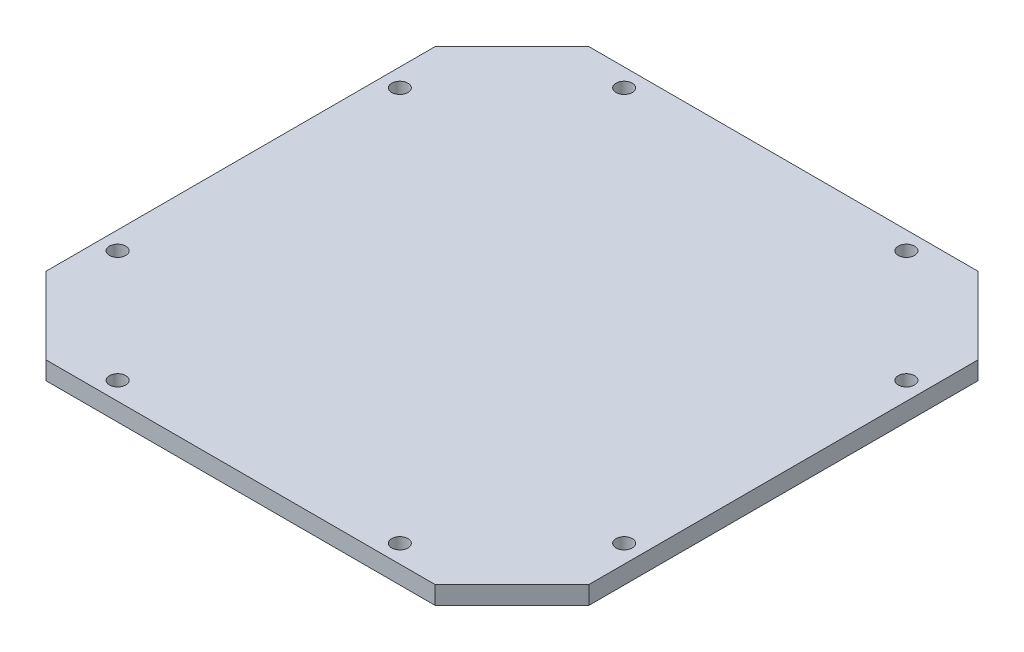
ISO-10303-21;
HEADER;
FILE_DESCRIPTION(('STEP AP214'),'2;1');
FILE_NAME('part.step','',(''),(''),'','','');
FILE_SCHEMA(('AUTOMOTIVE_DESIGN { 1 0 10303 214 1 1 1 1 }'));
ENDSEC;
DATA;
#1=APPLICATION_CONTEXT('core data for automotive mechanical design processes');
#2=APPLICATION_PROTOCOL_DEFINITION('international standard','automotive_design',2000,#1);
#3=PRODUCT_CONTEXT('',#1,'mechanical');
#4=PRODUCT('Part','Part','',(#3));
#5=PRODUCT_RELATED_PRODUCT_CATEGORY('part','',(#4));
#6=PRODUCT_DEFINITION_FORMATION('','',#4);
#7=PRODUCT_DEFINITION_CONTEXT('part definition',#1,'design');
#8=PRODUCT_DEFINITION('design','',#6,#7);
#9=PRODUCT_DEFINITION_SHAPE('','',#8);
#10=(LENGTH_UNIT() NAMED_UNIT(*) SI_UNIT(.MILLI.,.METRE.));
#11=(NAMED_UNIT(*) PLANE_ANGLE_UNIT() SI_UNIT($,.RADIAN.));
#12=(NAMED_UNIT(*) SI_UNIT($,.STERADIAN.) SOLID_ANGLE_UNIT());
#13=UNCERTAINTY_MEASURE_WITH_UNIT(LENGTH_MEASURE(1.E-05),#10,'distance_accuracy_value','');
#14=(GEOMETRIC_REPRESENTATION_CONTEXT(3) GLOBAL_UNCERTAINTY_ASSIGNED_CONTEXT((#13)) GLOBAL_UNIT_ASSIGNED_CONTEXT((#10,
#11,#12)) REPRESENTATION_CONTEXT('',''));
#15=CARTESIAN_POINT('',(0.,0.,0.));
#16=DIRECTION('',(0.,0.,1.));
#17=DIRECTION('',(1.,0.,0.));
#18=AXIS2_PLACEMENT_3D('',#15,#16,#17);
#19=CARTESIAN_POINT('',(0.,5.,0.));
#20=DIRECTION('',(0.,-1.,0.));
#21=DIRECTION('',(0.,0.,-1.));
#22=AXIS2_PLACEMENT_3D('',#19,#20,#21);
#23=PLANE('',#22);
#24=DIRECTION('',(-0.707106781186546,0.,-0.707106781186549));
#25=VECTOR('',#24,1.);
#26=CARTESIAN_POINT('',(107.573593128807,5.,-150.));
#27=LINE('',#26,#25);
#28=CARTESIAN_POINT('',(150.,5.,-107.573593128807));
#29=VERTEX_POINT('',#28);
#30=CARTESIAN_POINT('',(107.573593128807,5.,-150.));
#31=VERTEX_POINT('',#30);
#32=EDGE_CURVE('E151',#29,#31,#27,.T.);
#33=ORIENTED_EDGE('',*,*,#32,.T.);
#34=DIRECTION('',(-1.,0.,0.));
#35=VECTOR('',#34,1.);
#36=CARTESIAN_POINT('',(107.573593128807,5.,-150.));
#37=LINE('',#36,#35);
#38=CARTESIAN_POINT('',(-107.573593128807,5.,-150.));
#39=VERTEX_POINT('',#38);
#40=EDGE_CURVE('E99',#31,#39,#37,.T.);
#41=ORIENTED_EDGE('',*,*,#40,.T.);
#42=DIRECTION('',(-0.707106781186546,0.,0.707106781186549));
#43=VECTOR('',#42,1.);
#44=CARTESIAN_POINT('',(-107.573593128807,5.,-150.));
#45=LINE('',#44,#43);
#46=CARTESIAN_POINT('',(-150.,5.,-107.573593128807));
#47=VERTEX_POINT('',#46);
#48=EDGE_CURVE('E166',#39,#47,#45,.T.);
#49=ORIENTED_EDGE('',*,*,#48,.T.);
#50=DIRECTION('',(0.,0.,1.));
#51=VECTOR('',#50,1.);
#52=CARTESIAN_POINT('',(-150.,5.,-107.573593128807));
#53=LINE('',#52,#51);
#54=CARTESIAN_POINT('',(-150.,5.,107.573593128807));
#55=VERTEX_POINT('',#54);
#56=EDGE_CURVE('E179',#47,#55,#53,.T.);
#57=ORIENTED_EDGE('',*,*,#56,.T.);
#58=DIRECTION('',(0.707106781186545,0.,0.70710678118655));
#59=VECTOR('',#58,1.);
#60=CARTESIAN_POINT('',(-150.,5.,107.573593128807));
#61=LINE('',#60,#59);
#62=CARTESIAN_POINT('',(-107.573593128807,5.,150.));
#63=VERTEX_POINT('',#62);
#64=EDGE_CURVE('E118',#55,#63,#61,.T.);
#65=ORIENTED_EDGE('',*,*,#64,.T.);
#66=DIRECTION('',(1.,0.,0.));
#67=VECTOR('',#66,1.);
#68=CARTESIAN_POINT('',(-107.573593128807,5.,150.));
#69=LINE('',#68,#67);
#70=CARTESIAN_POINT('',(107.573593128807,5.,150.));
#71=VERTEX_POINT('',#70);
#72=EDGE_CURVE('E112',#63,#71,#69,.T.);
#73=ORIENTED_EDGE('',*,*,#72,.T.);
#74=DIRECTION('',(0.707106781186545,0.,-0.70710678118655));
#75=VECTOR('',#74,1.);
#76=CARTESIAN_POINT('',(150.,5.,107.573593128807));
#77=LINE('',#76,#75);
#78=CARTESIAN_POINT('',(150.,5.,107.573593128807));
#79=VERTEX_POINT('',#78);
#80=EDGE_CURVE('E116',#71,#79,#77,.T.);
#81=ORIENTED_EDGE('',*,*,#80,.T.);
#82=DIRECTION('',(0.,0.,-1.));
#83=VECTOR('',#82,1.);
#84=CARTESIAN_POINT('',(150.,5.,-107.573593128807));
#85=LINE('',#84,#83);
#86=EDGE_CURVE('E56',#79,#29,#85,.T.);
#87=ORIENTED_EDGE('',*,*,#86,.T.);
#88=EDGE_LOOP('',(#33,#41,#49,#57,#65,#73,#81,#87));
#89=FACE_BOUND('',#88,.T.);
#90=CARTESIAN_POINT('',(-78.,5.,-140.));
#91=DIRECTION('',(0.,1.,0.));
#92=DIRECTION('',(0.,0.,1.));
#93=AXIS2_PLACEMENT_3D('',#90,#91,#92);
#94=CIRCLE('',#93,4.50000000000001);
#95=CARTESIAN_POINT('',(-78.,5.,-135.5));
#96=VERTEX_POINT('',#95);
#97=EDGE_CURVE('E140',#96,#96,#94,.T.);
#98=ORIENTED_EDGE('',*,*,#97,.F.);
#99=EDGE_LOOP('',(#98));
#100=FACE_BOUND('',#99,.T.);
#101=CARTESIAN_POINT('',(78.,5.,-140.));
#102=DIRECTION('',(0.,1.,0.));
#103=DIRECTION('',(0.,0.,-1.));
#104=AXIS2_PLACEMENT_3D('',#101,#102,#103);
#105=CIRCLE('',#104,4.50000000000001);
#106=CARTESIAN_POINT('',(78.,5.,-144.5));
#107=VERTEX_POINT('',#106);
#108=EDGE_CURVE('E188',#107,#107,#105,.T.);
#109=ORIENTED_EDGE('',*,*,#108,.F.);
#110=EDGE_LOOP('',(#109));
#111=FACE_BOUND('',#110,.T.);
#112=CARTESIAN_POINT('',(-140.,5.,-78.));
#113=DIRECTION('',(0.,1.,0.));
#114=DIRECTION('',(0.,0.,1.));
#115=AXIS2_PLACEMENT_3D('',#112,#113,#114);
#116=CIRCLE('',#115,4.49999999999999);
#117=CARTESIAN_POINT('',(-140.,5.,-73.5));
#118=VERTEX_POINT('',#117);
#119=EDGE_CURVE('E194',#118,#118,#116,.T.);
#120=ORIENTED_EDGE('',*,*,#119,.F.);
#121=EDGE_LOOP('',(#120));
#122=FACE_BOUND('',#121,.T.);
#123=CARTESIAN_POINT('',(140.,5.,-78.));
#124=DIRECTION('',(0.,1.,0.));
#125=DIRECTION('',(0.,0.,-1.));
#126=AXIS2_PLACEMENT_3D('',#123,#124,#125);
#127=CIRCLE('',#126,4.49999999999999);
#128=CARTESIAN_POINT('',(140.,5.,-82.5));
#129=VERTEX_POINT('',#128);
#130=EDGE_CURVE('E200',#129,#129,#127,.T.);
#131=ORIENTED_EDGE('',*,*,#130,.F.);
#132=EDGE_LOOP('',(#131));
#133=FACE_BOUND('',#132,.T.);
#134=CARTESIAN_POINT('',(-140.,5.,77.9999999999999));
#135=DIRECTION('',(0.,1.,0.));
#136=DIRECTION('',(0.,0.,1.));
#137=AXIS2_PLACEMENT_3D('',#134,#135,#136);
#138=CIRCLE('',#137,4.49999999999999);
#139=CARTESIAN_POINT('',(-140.,5.,82.4999999999999));
#140=VERTEX_POINT('',#139);
#141=EDGE_CURVE('E206',#140,#140,#138,.T.);
#142=ORIENTED_EDGE('',*,*,#141,.F.);
#143=EDGE_LOOP('',(#142));
#144=FACE_BOUND('',#143,.T.);
#145=CARTESIAN_POINT('',(140.,5.,77.9999999999999));
#146=DIRECTION('',(0.,1.,0.));
#147=DIRECTION('',(0.,0.,-1.));
#148=AXIS2_PLACEMENT_3D('',#145,#146,#147);
#149=CIRCLE('',#148,4.49999999999999);
#150=CARTESIAN_POINT('',(140.,5.,73.5));
#151=VERTEX_POINT('',#150);
#152=EDGE_CURVE('E212',#151,#151,#149,.T.);
#153=ORIENTED_EDGE('',*,*,#152,.F.);
#154=EDGE_LOOP('',(#153));
#155=FACE_BOUND('',#154,.T.);
#156=CARTESIAN_POINT('',(-78.,5.,140.));
#157=DIRECTION('',(0.,1.,0.));
#158=DIRECTION('',(0.,0.,1.));
#159=AXIS2_PLACEMENT_3D('',#156,#157,#158);
#160=CIRCLE('',#159,4.50000000000001);
#161=CARTESIAN_POINT('',(-78.,5.,144.5));
#162=VERTEX_POINT('',#161);
#163=EDGE_CURVE('E218',#162,#162,#160,.T.);
#164=ORIENTED_EDGE('',*,*,#163,.F.);
#165=EDGE_LOOP('',(#164));
#166=FACE_BOUND('',#165,.T.);
#167=CARTESIAN_POINT('',(78.,5.,140.));
#168=DIRECTION('',(0.,1.,0.));
#169=DIRECTION('',(0.,0.,-1.));
#170=AXIS2_PLACEMENT_3D('',#167,#168,#169);
#171=CIRCLE('',#170,4.50000000000001);
#172=CARTESIAN_POINT('',(78.,5.,135.5));
#173=VERTEX_POINT('',#172);
#174=EDGE_CURVE('E224',#173,#173,#171,.T.);
#175=ORIENTED_EDGE('',*,*,#174,.F.);
#176=EDGE_LOOP('',(#175));
#177=FACE_BOUND('',#176,.T.);
#178=ADVANCED_FACE('F39',(#89,#100,#111,#122,#133,#144,#155,#166,#177),#23,.F.);
#179=CARTESIAN_POINT('',(0.,-5.,0.));
#180=DIRECTION('',(0.,-1.,0.));
#181=DIRECTION('',(0.,0.,-1.));
#182=AXIS2_PLACEMENT_3D('',#179,#180,#181);
#183=PLANE('',#182);
#184=CARTESIAN_POINT('',(-78.,-5.,140.));
#185=DIRECTION('',(0.,1.,0.));
#186=DIRECTION('',(0.,0.,1.));
#187=AXIS2_PLACEMENT_3D('',#184,#185,#186);
#188=CIRCLE('',#187,4.50000000000001);
#189=CARTESIAN_POINT('',(-78.,-5.,144.5));
#190=VERTEX_POINT('',#189);
#191=EDGE_CURVE('E221',#190,#190,#188,.T.);
#192=ORIENTED_EDGE('',*,*,#191,.T.);
#193=EDGE_LOOP('',(#192));
#194=FACE_BOUND('',#193,.T.);
#195=CARTESIAN_POINT('',(-140.,-5.,77.9999999999999));
#196=DIRECTION('',(0.,1.,0.));
#197=DIRECTION('',(0.,0.,1.));
#198=AXIS2_PLACEMENT_3D('',#195,#196,#197);
#199=CIRCLE('',#198,4.49999999999999);
#200=CARTESIAN_POINT('',(-140.,-5.,82.4999999999999));
#201=VERTEX_POINT('',#200);
#202=EDGE_CURVE('E209',#201,#201,#199,.T.);
#203=ORIENTED_EDGE('',*,*,#202,.T.);
#204=EDGE_LOOP('',(#203));
#205=FACE_BOUND('',#204,.T.);
#206=CARTESIAN_POINT('',(-140.,-5.,-78.));
#207=DIRECTION('',(0.,1.,0.));
#208=DIRECTION('',(0.,0.,1.));
#209=AXIS2_PLACEMENT_3D('',#206,#207,#208);
#210=CIRCLE('',#209,4.49999999999999);
#211=CARTESIAN_POINT('',(-140.,-5.,-73.5));
#212=VERTEX_POINT('',#211);
#213=EDGE_CURVE('E197',#212,#212,#210,.T.);
#214=ORIENTED_EDGE('',*,*,#213,.T.);
#215=EDGE_LOOP('',(#214));
#216=FACE_BOUND('',#215,.T.);
#217=CARTESIAN_POINT('',(-78.,-5.,-140.));
#218=DIRECTION('',(0.,1.,0.));
#219=DIRECTION('',(0.,0.,1.));
#220=AXIS2_PLACEMENT_3D('',#217,#218,#219);
#221=CIRCLE('',#220,4.50000000000001);
#222=CARTESIAN_POINT('',(-78.,-5.,-135.5));
#223=VERTEX_POINT('',#222);
#224=EDGE_CURVE('E185',#223,#223,#221,.T.);
#225=ORIENTED_EDGE('',*,*,#224,.T.);
#226=EDGE_LOOP('',(#225));
#227=FACE_BOUND('',#226,.T.);
#228=DIRECTION('',(-0.707106781186546,0.,-0.707106781186549));
#229=VECTOR('',#228,1.);
#230=CARTESIAN_POINT('',(107.573593128807,-5.,-150.));
#231=LINE('',#230,#229);
#232=CARTESIAN_POINT('',(150.,-5.,-107.573593128807));
#233=VERTEX_POINT('',#232);
#234=CARTESIAN_POINT('',(107.573593128807,-5.,-150.));
#235=VERTEX_POINT('',#234);
#236=EDGE_CURVE('E136',#233,#235,#231,.T.);
#237=ORIENTED_EDGE('',*,*,#236,.F.);
#238=DIRECTION('',(0.,0.,-1.));
#239=VECTOR('',#238,1.);
#240=CARTESIAN_POINT('',(150.,-5.,-107.573593128807));
#241=LINE('',#240,#239);
#242=CARTESIAN_POINT('',(150.,-5.,107.573593128807));
#243=VERTEX_POINT('',#242);
#244=EDGE_CURVE('E91',#243,#233,#241,.T.);
#245=ORIENTED_EDGE('',*,*,#244,.F.);
#246=DIRECTION('',(0.707106781186545,0.,-0.70710678118655));
#247=VECTOR('',#246,1.);
#248=CARTESIAN_POINT('',(150.,-5.,107.573593128807));
#249=LINE('',#248,#247);
#250=CARTESIAN_POINT('',(107.573593128807,-5.,150.));
#251=VERTEX_POINT('',#250);
#252=EDGE_CURVE('E85',#251,#243,#249,.T.);
#253=ORIENTED_EDGE('',*,*,#252,.F.);
#254=DIRECTION('',(1.,0.,0.));
#255=VECTOR('',#254,1.);
#256=CARTESIAN_POINT('',(-107.573593128807,-5.,150.));
#257=LINE('',#256,#255);
#258=CARTESIAN_POINT('',(-107.573593128807,-5.,150.));
#259=VERTEX_POINT('',#258);
#260=EDGE_CURVE('E126',#259,#251,#257,.T.);
#261=ORIENTED_EDGE('',*,*,#260,.F.);
#262=DIRECTION('',(0.707106781186545,0.,0.70710678118655));
#263=VECTOR('',#262,1.);
#264=CARTESIAN_POINT('',(-150.,-5.,107.573593128807));
#265=LINE('',#264,#263);
#266=CARTESIAN_POINT('',(-150.,-5.,107.573593128807));
#267=VERTEX_POINT('',#266);
#268=EDGE_CURVE('E146',#267,#259,#265,.T.);
#269=ORIENTED_EDGE('',*,*,#268,.F.);
#270=DIRECTION('',(0.,0.,1.));
#271=VECTOR('',#270,1.);
#272=CARTESIAN_POINT('',(-150.,-5.,-107.573593128807));
#273=LINE('',#272,#271);
#274=CARTESIAN_POINT('',(-150.,-5.,-107.573593128807));
#275=VERTEX_POINT('',#274);
#276=EDGE_CURVE('E144',#275,#267,#273,.T.);
#277=ORIENTED_EDGE('',*,*,#276,.F.);
#278=DIRECTION('',(-0.707106781186546,0.,0.707106781186549));
#279=VECTOR('',#278,1.);
#280=CARTESIAN_POINT('',(-107.573593128807,-5.,-150.));
#281=LINE('',#280,#279);
#282=CARTESIAN_POINT('',(-107.573593128807,-5.,-150.));
#283=VERTEX_POINT('',#282);
#284=EDGE_CURVE('E142',#283,#275,#281,.T.);
#285=ORIENTED_EDGE('',*,*,#284,.F.);
#286=DIRECTION('',(-1.,0.,0.));
#287=VECTOR('',#286,1.);
#288=CARTESIAN_POINT('',(107.573593128807,-5.,-150.));
#289=LINE('',#288,#287);
#290=EDGE_CURVE('E139',#235,#283,#289,.T.);
#291=ORIENTED_EDGE('',*,*,#290,.F.);
#292=EDGE_LOOP('',(#237,#245,#253,#261,#269,#277,#285,#291));
#293=FACE_BOUND('',#292,.T.);
#294=CARTESIAN_POINT('',(78.,-5.,-140.));
#295=DIRECTION('',(0.,1.,0.));
#296=DIRECTION('',(0.,0.,-1.));
#297=AXIS2_PLACEMENT_3D('',#294,#295,#296);
#298=CIRCLE('',#297,4.50000000000001);
#299=CARTESIAN_POINT('',(78.,-5.,-144.5));
#300=VERTEX_POINT('',#299);
#301=EDGE_CURVE('E191',#300,#300,#298,.T.);
#302=ORIENTED_EDGE('',*,*,#301,.T.);
#303=EDGE_LOOP('',(#302));
#304=FACE_BOUND('',#303,.T.);
#305=CARTESIAN_POINT('',(140.,-5.,-78.));
#306=DIRECTION('',(0.,1.,0.));
#307=DIRECTION('',(0.,0.,-1.));
#308=AXIS2_PLACEMENT_3D('',#305,#306,#307);
#309=CIRCLE('',#308,4.49999999999999);
#310=CARTESIAN_POINT('',(140.,-5.,-82.5));
#311=VERTEX_POINT('',#310);
#312=EDGE_CURVE('E203',#311,#311,#309,.T.);
#313=ORIENTED_EDGE('',*,*,#312,.T.);
#314=EDGE_LOOP('',(#313));
#315=FACE_BOUND('',#314,.T.);
#316=CARTESIAN_POINT('',(140.,-5.,77.9999999999999));
#317=DIRECTION('',(0.,1.,0.));
#318=DIRECTION('',(0.,0.,-1.));
#319=AXIS2_PLACEMENT_3D('',#316,#317,#318);
#320=CIRCLE('',#319,4.49999999999999);
#321=CARTESIAN_POINT('',(140.,-5.,73.5));
#322=VERTEX_POINT('',#321);
#323=EDGE_CURVE('E215',#322,#322,#320,.T.);
#324=ORIENTED_EDGE('',*,*,#323,.T.);
#325=EDGE_LOOP('',(#324));
#326=FACE_BOUND('',#325,.T.);
#327=CARTESIAN_POINT('',(78.,-5.,140.));
#328=DIRECTION('',(0.,1.,0.));
#329=DIRECTION('',(0.,0.,-1.));
#330=AXIS2_PLACEMENT_3D('',#327,#328,#329);
#331=CIRCLE('',#330,4.50000000000001);
#332=CARTESIAN_POINT('',(78.,-5.,135.5));
#333=VERTEX_POINT('',#332);
#334=EDGE_CURVE('E227',#333,#333,#331,.T.);
#335=ORIENTED_EDGE('',*,*,#334,.T.);
#336=EDGE_LOOP('',(#335));
#337=FACE_BOUND('',#336,.T.);
#338=ADVANCED_FACE('F170',(#194,#205,#216,#227,#293,#304,#315,#326,#337),#183,.T.);
#339=CARTESIAN_POINT('',(107.573593128807,5.,-150.));
#340=DIRECTION('',(-0.707106781186549,0.,0.707106781186546));
#341=DIRECTION('',(0.707106781186546,0.,0.707106781186549));
#342=AXIS2_PLACEMENT_3D('',#339,#340,#341);
#343=PLANE('',#342);
#344=ORIENTED_EDGE('',*,*,#236,.T.);
#345=DIRECTION('',(0.,-1.,0.));
#346=VECTOR('',#345,1.);
#347=CARTESIAN_POINT('',(107.573593128807,5.,-150.));
#348=LINE('',#347,#346);
#349=EDGE_CURVE('E11',#31,#235,#348,.T.);
#350=ORIENTED_EDGE('',*,*,#349,.F.);
#351=ORIENTED_EDGE('',*,*,#32,.F.);
#352=DIRECTION('',(0.,-1.,0.));
#353=VECTOR('',#352,1.);
#354=CARTESIAN_POINT('',(150.,5.,-107.573593128807));
#355=LINE('',#354,#353);
#356=EDGE_CURVE('E132',#29,#233,#355,.T.);
#357=ORIENTED_EDGE('',*,*,#356,.T.);
#358=EDGE_LOOP('',(#344,#350,#351,#357));
#359=FACE_BOUND('',#358,.T.);
#360=ADVANCED_FACE('F41',(#359),#343,.F.);
#361=CARTESIAN_POINT('',(107.573593128807,5.,-150.));
#362=DIRECTION('',(0.,0.,1.));
#363=DIRECTION('',(1.,0.,0.));
#364=AXIS2_PLACEMENT_3D('',#361,#362,#363);
#365=PLANE('',#364);
#366=ORIENTED_EDGE('',*,*,#290,.T.);
#367=DIRECTION('',(0.,-1.,0.));
#368=VECTOR('',#367,1.);
#369=CARTESIAN_POINT('',(-107.573593128807,5.,-150.));
#370=LINE('',#369,#368);
#371=EDGE_CURVE('E48',#39,#283,#370,.T.);
#372=ORIENTED_EDGE('',*,*,#371,.F.);
#373=ORIENTED_EDGE('',*,*,#40,.F.);
#374=ORIENTED_EDGE('',*,*,#349,.T.);
#375=EDGE_LOOP('',(#366,#372,#373,#374));
#376=FACE_BOUND('',#375,.T.);
#377=ADVANCED_FACE('F259',(#376),#365,.F.);
#378=CARTESIAN_POINT('',(-107.573593128807,5.,-150.));
#379=DIRECTION('',(0.707106781186549,0.,0.707106781186546));
#380=DIRECTION('',(0.707106781186546,0.,-0.707106781186549));
#381=AXIS2_PLACEMENT_3D('',#378,#379,#380);
#382=PLANE('',#381);
#383=ORIENTED_EDGE('',*,*,#284,.T.);
#384=DIRECTION('',(0.,-1.,0.));
#385=VECTOR('',#384,1.);
#386=CARTESIAN_POINT('',(-150.,5.,-107.573593128807));
#387=LINE('',#386,#385);
#388=EDGE_CURVE('E158',#47,#275,#387,.T.);
#389=ORIENTED_EDGE('',*,*,#388,.F.);
#390=ORIENTED_EDGE('',*,*,#48,.F.);
#391=ORIENTED_EDGE('',*,*,#371,.T.);
#392=EDGE_LOOP('',(#383,#389,#390,#391));
#393=FACE_BOUND('',#392,.T.);
#394=ADVANCED_FACE('F164',(#393),#382,.F.);
#395=CARTESIAN_POINT('',(-150.,5.,-107.573593128807));
#396=DIRECTION('',(1.,0.,0.));
#397=DIRECTION('',(0.,0.,-1.));
#398=AXIS2_PLACEMENT_3D('',#395,#396,#397);
#399=PLANE('',#398);
#400=ORIENTED_EDGE('',*,*,#276,.T.);
#401=DIRECTION('',(0.,-1.,0.));
#402=VECTOR('',#401,1.);
#403=CARTESIAN_POINT('',(-150.,5.,107.573593128807));
#404=LINE('',#403,#402);
#405=EDGE_CURVE('E155',#55,#267,#404,.T.);
#406=ORIENTED_EDGE('',*,*,#405,.F.);
#407=ORIENTED_EDGE('',*,*,#56,.F.);
#408=ORIENTED_EDGE('',*,*,#388,.T.);
#409=EDGE_LOOP('',(#400,#406,#407,#408));
#410=FACE_BOUND('',#409,.T.);
#411=ADVANCED_FACE('F175',(#410),#399,.F.);
#412=CARTESIAN_POINT('',(-150.,5.,107.573593128807));
#413=DIRECTION('',(0.70710678118655,0.,-0.707106781186545));
#414=DIRECTION('',(-0.707106781186545,0.,-0.70710678118655));
#415=AXIS2_PLACEMENT_3D('',#412,#413,#414);
#416=PLANE('',#415);
#417=ORIENTED_EDGE('',*,*,#268,.T.);
#418=DIRECTION('',(0.,-1.,0.));
#419=VECTOR('',#418,1.);
#420=CARTESIAN_POINT('',(-107.573593128807,5.,150.));
#421=LINE('',#420,#419);
#422=EDGE_CURVE('E127',#63,#259,#421,.T.);
#423=ORIENTED_EDGE('',*,*,#422,.F.);
#424=ORIENTED_EDGE('',*,*,#64,.F.);
#425=ORIENTED_EDGE('',*,*,#405,.T.);
#426=EDGE_LOOP('',(#417,#423,#424,#425));
#427=FACE_BOUND('',#426,.T.);
#428=ADVANCED_FACE('F178',(#427),#416,.F.);
#429=CARTESIAN_POINT('',(-107.573593128807,5.,150.));
#430=DIRECTION('',(0.,0.,-1.));
#431=DIRECTION('',(-1.,0.,0.));
#432=AXIS2_PLACEMENT_3D('',#429,#430,#431);
#433=PLANE('',#432);
#434=ORIENTED_EDGE('',*,*,#260,.T.);
#435=DIRECTION('',(0.,-1.,0.));
#436=VECTOR('',#435,1.);
#437=CARTESIAN_POINT('',(107.573593128807,5.,150.));
#438=LINE('',#437,#436);
#439=EDGE_CURVE('E123',#71,#251,#438,.T.);
#440=ORIENTED_EDGE('',*,*,#439,.F.);
#441=ORIENTED_EDGE('',*,*,#72,.F.);
#442=ORIENTED_EDGE('',*,*,#422,.T.);
#443=EDGE_LOOP('',(#434,#440,#441,#442));
#444=FACE_BOUND('',#443,.T.);
#445=ADVANCED_FACE('F124',(#444),#433,.F.);
#446=CARTESIAN_POINT('',(150.,5.,107.573593128807));
#447=DIRECTION('',(-0.70710678118655,0.,-0.707106781186545));
#448=DIRECTION('',(-0.707106781186545,0.,0.70710678118655));
#449=AXIS2_PLACEMENT_3D('',#446,#447,#448);
#450=PLANE('',#449);
#451=ORIENTED_EDGE('',*,*,#252,.T.);
#452=DIRECTION('',(0.,-1.,0.));
#453=VECTOR('',#452,1.);
#454=CARTESIAN_POINT('',(150.,5.,107.573593128807));
#455=LINE('',#454,#453);
#456=EDGE_CURVE('E128',#79,#243,#455,.T.);
#457=ORIENTED_EDGE('',*,*,#456,.F.);
#458=ORIENTED_EDGE('',*,*,#80,.F.);
#459=ORIENTED_EDGE('',*,*,#439,.T.);
#460=EDGE_LOOP('',(#451,#457,#458,#459));
#461=FACE_BOUND('',#460,.T.);
#462=ADVANCED_FACE('F130',(#461),#450,.F.);
#463=CARTESIAN_POINT('',(150.,5.,-107.573593128807));
#464=DIRECTION('',(-1.,0.,0.));
#465=DIRECTION('',(0.,0.,1.));
#466=AXIS2_PLACEMENT_3D('',#463,#464,#465);
#467=PLANE('',#466);
#468=ORIENTED_EDGE('',*,*,#244,.T.);
#469=ORIENTED_EDGE('',*,*,#356,.F.);
#470=ORIENTED_EDGE('',*,*,#86,.F.);
#471=ORIENTED_EDGE('',*,*,#456,.T.);
#472=EDGE_LOOP('',(#468,#469,#470,#471));
#473=FACE_BOUND('',#472,.T.);
#474=ADVANCED_FACE('F247',(#473),#467,.F.);
#475=CARTESIAN_POINT('',(-78.,5.,-140.));
#476=DIRECTION('',(0.,-1.,0.));
#477=DIRECTION('',(0.,0.,-1.));
#478=AXIS2_PLACEMENT_3D('',#475,#476,#477);
#479=CYLINDRICAL_SURFACE('',#478,4.50000000000001);
#480=ORIENTED_EDGE('',*,*,#97,.T.);
#481=EDGE_LOOP('',(#480));
#482=FACE_BOUND('',#481,.T.);
#483=ORIENTED_EDGE('',*,*,#224,.F.);
#484=EDGE_LOOP('',(#483));
#485=FACE_BOUND('',#484,.T.);
#486=ADVANCED_FACE('F244',(#482,#485),#479,.F.);
#487=CARTESIAN_POINT('',(78.,5.,-140.));
#488=DIRECTION('',(0.,-1.,0.));
#489=DIRECTION('',(0.,0.,-1.));
#490=AXIS2_PLACEMENT_3D('',#487,#488,#489);
#491=CYLINDRICAL_SURFACE('',#490,4.50000000000001);
#492=ORIENTED_EDGE('',*,*,#108,.T.);
#493=EDGE_LOOP('',(#492));
#494=FACE_BOUND('',#493,.T.);
#495=ORIENTED_EDGE('',*,*,#301,.F.);
#496=EDGE_LOOP('',(#495));
#497=FACE_BOUND('',#496,.T.);
#498=ADVANCED_FACE('F322',(#494,#497),#491,.F.);
#499=CARTESIAN_POINT('',(-140.,5.,-78.));
#500=DIRECTION('',(0.,-1.,0.));
#501=DIRECTION('',(0.,0.,-1.));
#502=AXIS2_PLACEMENT_3D('',#499,#500,#501);
#503=CYLINDRICAL_SURFACE('',#502,4.49999999999999);
#504=ORIENTED_EDGE('',*,*,#119,.T.);
#505=EDGE_LOOP('',(#504));
#506=FACE_BOUND('',#505,.T.);
#507=ORIENTED_EDGE('',*,*,#213,.F.);
#508=EDGE_LOOP('',(#507));
#509=FACE_BOUND('',#508,.T.);
#510=ADVANCED_FACE('F330',(#506,#509),#503,.F.);
#511=CARTESIAN_POINT('',(140.,5.,-78.));
#512=DIRECTION('',(0.,-1.,0.));
#513=DIRECTION('',(0.,0.,-1.));
#514=AXIS2_PLACEMENT_3D('',#511,#512,#513);
#515=CYLINDRICAL_SURFACE('',#514,4.49999999999999);
#516=ORIENTED_EDGE('',*,*,#130,.T.);
#517=EDGE_LOOP('',(#516));
#518=FACE_BOUND('',#517,.T.);
#519=ORIENTED_EDGE('',*,*,#312,.F.);
#520=EDGE_LOOP('',(#519));
#521=FACE_BOUND('',#520,.T.);
#522=ADVANCED_FACE('F338',(#518,#521),#515,.F.);
#523=CARTESIAN_POINT('',(-140.,5.,77.9999999999999));
#524=DIRECTION('',(0.,-1.,0.));
#525=DIRECTION('',(0.,0.,-1.));
#526=AXIS2_PLACEMENT_3D('',#523,#524,#525);
#527=CYLINDRICAL_SURFACE('',#526,4.49999999999999);
#528=ORIENTED_EDGE('',*,*,#141,.T.);
#529=EDGE_LOOP('',(#528));
#530=FACE_BOUND('',#529,.T.);
#531=ORIENTED_EDGE('',*,*,#202,.F.);
#532=EDGE_LOOP('',(#531));
#533=FACE_BOUND('',#532,.T.);
#534=ADVANCED_FACE('F347',(#530,#533),#527,.F.);
#535=CARTESIAN_POINT('',(140.,5.,77.9999999999999));
#536=DIRECTION('',(0.,-1.,0.));
#537=DIRECTION('',(0.,0.,-1.));
#538=AXIS2_PLACEMENT_3D('',#535,#536,#537);
#539=CYLINDRICAL_SURFACE('',#538,4.49999999999999);
#540=ORIENTED_EDGE('',*,*,#152,.T.);
#541=EDGE_LOOP('',(#540));
#542=FACE_BOUND('',#541,.T.);
#543=ORIENTED_EDGE('',*,*,#323,.F.);
#544=EDGE_LOOP('',(#543));
#545=FACE_BOUND('',#544,.T.);
#546=ADVANCED_FACE('F356',(#542,#545),#539,.F.);
#547=CARTESIAN_POINT('',(-78.,5.,140.));
#548=DIRECTION('',(0.,-1.,0.));
#549=DIRECTION('',(0.,0.,-1.));
#550=AXIS2_PLACEMENT_3D('',#547,#548,#549);
#551=CYLINDRICAL_SURFACE('',#550,4.50000000000001);
#552=ORIENTED_EDGE('',*,*,#163,.T.);
#553=EDGE_LOOP('',(#552));
#554=FACE_BOUND('',#553,.T.);
#555=ORIENTED_EDGE('',*,*,#191,.F.);
#556=EDGE_LOOP('',(#555));
#557=FACE_BOUND('',#556,.T.);
#558=ADVANCED_FACE('F365',(#554,#557),#551,.F.);
#559=CARTESIAN_POINT('',(78.,5.,140.));
#560=DIRECTION('',(0.,-1.,0.));
#561=DIRECTION('',(0.,0.,-1.));
#562=AXIS2_PLACEMENT_3D('',#559,#560,#561);
#563=CYLINDRICAL_SURFACE('',#562,4.50000000000001);
#564=ORIENTED_EDGE('',*,*,#174,.T.);
#565=EDGE_LOOP('',(#564));
#566=FACE_BOUND('',#565,.T.);
#567=ORIENTED_EDGE('',*,*,#334,.F.);
#568=EDGE_LOOP('',(#567));
#569=FACE_BOUND('',#568,.T.);
#570=ADVANCED_FACE('F233',(#566,#569),#563,.F.);
#571=CLOSED_SHELL('',(#178,#338,#360,#377,#394,#411,#428,#445,#462,#474,#486,#498,#510,#522,
#534,#546,#558,#570));
#572=MANIFOLD_SOLID_BREP('B2',#571);
#573=ADVANCED_BREP_SHAPE_REPRESENTATION('',(#18,#572),#14);
#574=SHAPE_DEFINITION_REPRESENTATION(#9,#573);
ENDSEC;
END-ISO-10303-21;
